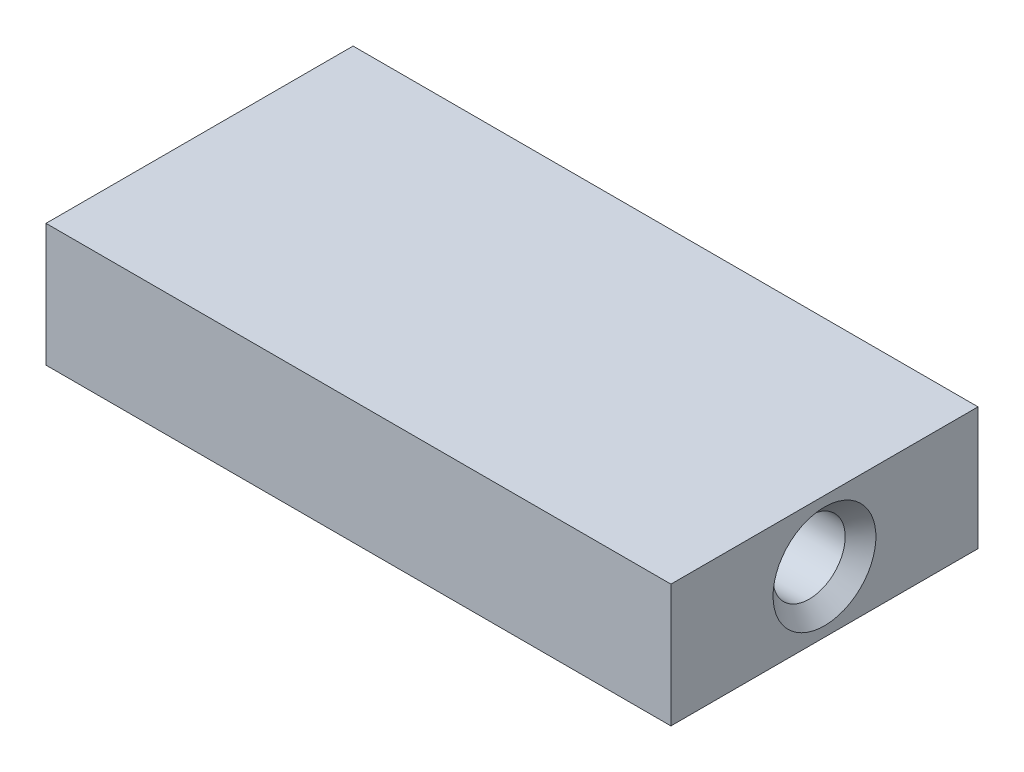
ISO-10303-21;
HEADER;
FILE_DESCRIPTION(('STEP AP214'),'2;1');
FILE_NAME('part.step','',(''),(''),'','','');
FILE_SCHEMA(('AUTOMOTIVE_DESIGN { 1 0 10303 214 1 1 1 1 }'));
ENDSEC;
DATA;
#1=APPLICATION_CONTEXT('core data for automotive mechanical design processes');
#2=APPLICATION_PROTOCOL_DEFINITION('international standard','automotive_design',2000,#1);
#3=PRODUCT_CONTEXT('',#1,'mechanical');
#4=PRODUCT('Part','Part','',(#3));
#5=PRODUCT_RELATED_PRODUCT_CATEGORY('part','',(#4));
#6=PRODUCT_DEFINITION_FORMATION('','',#4);
#7=PRODUCT_DEFINITION_CONTEXT('part definition',#1,'design');
#8=PRODUCT_DEFINITION('design','',#6,#7);
#9=PRODUCT_DEFINITION_SHAPE('','',#8);
#10=(LENGTH_UNIT() NAMED_UNIT(*) SI_UNIT(.MILLI.,.METRE.));
#11=(NAMED_UNIT(*) PLANE_ANGLE_UNIT() SI_UNIT($,.RADIAN.));
#12=(NAMED_UNIT(*) SI_UNIT($,.STERADIAN.) SOLID_ANGLE_UNIT());
#13=UNCERTAINTY_MEASURE_WITH_UNIT(LENGTH_MEASURE(1.E-05),#10,'distance_accuracy_value','');
#14=(GEOMETRIC_REPRESENTATION_CONTEXT(3) GLOBAL_UNCERTAINTY_ASSIGNED_CONTEXT((#13)) GLOBAL_UNIT_ASSIGNED_CONTEXT((#10,
#11,#12)) REPRESENTATION_CONTEXT('',''));
#15=CARTESIAN_POINT('',(0.,0.,0.));
#16=DIRECTION('',(0.,0.,1.));
#17=DIRECTION('',(1.,0.,0.));
#18=AXIS2_PLACEMENT_3D('',#15,#16,#17);
#19=CARTESIAN_POINT('',(20.35,8.,-10.));
#20=DIRECTION('',(-1.,0.,0.));
#21=DIRECTION('',(0.,0.,1.));
#22=AXIS2_PLACEMENT_3D('',#19,#20,#21);
#23=PLANE('',#22);
#24=CARTESIAN_POINT('',(20.35,4.,0.));
#25=DIRECTION('',(-1.,0.,0.));
#26=DIRECTION('',(0.,0.,1.));
#27=AXIS2_PLACEMENT_3D('',#24,#25,#26);
#28=CIRCLE('',#27,3.35);
#29=CARTESIAN_POINT('',(20.35,4.,3.35));
#30=VERTEX_POINT('',#29);
#31=EDGE_CURVE('E11',#30,#30,#28,.T.);
#32=ORIENTED_EDGE('',*,*,#31,.T.);
#33=EDGE_LOOP('',(#32));
#34=FACE_BOUND('',#33,.T.);
#35=DIRECTION('',(0.,0.,-1.));
#36=VECTOR('',#35,1.);
#37=CARTESIAN_POINT('',(20.35,0.,-10.));
#38=LINE('',#37,#36);
#39=CARTESIAN_POINT('',(20.35,0.,10.));
#40=VERTEX_POINT('',#39);
#41=CARTESIAN_POINT('',(20.35,0.,-10.));
#42=VERTEX_POINT('',#41);
#43=EDGE_CURVE('E114',#40,#42,#38,.T.);
#44=ORIENTED_EDGE('',*,*,#43,.T.);
#45=DIRECTION('',(0.,-1.,0.));
#46=VECTOR('',#45,1.);
#47=CARTESIAN_POINT('',(20.35,8.,-10.));
#48=LINE('',#47,#46);
#49=CARTESIAN_POINT('',(20.35,8.,-10.));
#50=VERTEX_POINT('',#49);
#51=EDGE_CURVE('E105',#50,#42,#48,.T.);
#52=ORIENTED_EDGE('',*,*,#51,.F.);
#53=DIRECTION('',(0.,0.,-1.));
#54=VECTOR('',#53,1.);
#55=CARTESIAN_POINT('',(20.35,8.,-10.));
#56=LINE('',#55,#54);
#57=CARTESIAN_POINT('',(20.35,8.,10.));
#58=VERTEX_POINT('',#57);
#59=EDGE_CURVE('E99',#58,#50,#56,.T.);
#60=ORIENTED_EDGE('',*,*,#59,.F.);
#61=DIRECTION('',(0.,-1.,0.));
#62=VECTOR('',#61,1.);
#63=CARTESIAN_POINT('',(20.35,8.,10.));
#64=LINE('',#63,#62);
#65=EDGE_CURVE('E110',#58,#40,#64,.T.);
#66=ORIENTED_EDGE('',*,*,#65,.T.);
#67=EDGE_LOOP('',(#44,#52,#60,#66));
#68=FACE_BOUND('',#67,.T.);
#69=ADVANCED_FACE('F45',(#34,#68),#23,.F.);
#70=CARTESIAN_POINT('',(-20.35,8.,-10.));
#71=DIRECTION('',(0.,0.,1.));
#72=DIRECTION('',(1.,0.,0.));
#73=AXIS2_PLACEMENT_3D('',#70,#71,#72);
#74=PLANE('',#73);
#75=DIRECTION('',(-1.,0.,0.));
#76=VECTOR('',#75,1.);
#77=CARTESIAN_POINT('',(-20.35,0.,-10.));
#78=LINE('',#77,#76);
#79=CARTESIAN_POINT('',(-20.35,0.,-10.));
#80=VERTEX_POINT('',#79);
#81=EDGE_CURVE('E104',#42,#80,#78,.T.);
#82=ORIENTED_EDGE('',*,*,#81,.T.);
#83=DIRECTION('',(0.,-1.,0.));
#84=VECTOR('',#83,1.);
#85=CARTESIAN_POINT('',(-20.35,8.,-10.));
#86=LINE('',#85,#84);
#87=CARTESIAN_POINT('',(-20.35,8.,-10.));
#88=VERTEX_POINT('',#87);
#89=EDGE_CURVE('E102',#88,#80,#86,.T.);
#90=ORIENTED_EDGE('',*,*,#89,.F.);
#91=DIRECTION('',(-1.,0.,0.));
#92=VECTOR('',#91,1.);
#93=CARTESIAN_POINT('',(-20.35,8.,-10.));
#94=LINE('',#93,#92);
#95=EDGE_CURVE('E94',#50,#88,#94,.T.);
#96=ORIENTED_EDGE('',*,*,#95,.F.);
#97=ORIENTED_EDGE('',*,*,#51,.T.);
#98=EDGE_LOOP('',(#82,#90,#96,#97));
#99=FACE_BOUND('',#98,.T.);
#100=ADVANCED_FACE('F103',(#99),#74,.F.);
#101=CARTESIAN_POINT('',(-20.35,8.,-10.));
#102=DIRECTION('',(1.,0.,0.));
#103=DIRECTION('',(0.,0.,-1.));
#104=AXIS2_PLACEMENT_3D('',#101,#102,#103);
#105=PLANE('',#104);
#106=CARTESIAN_POINT('',(-20.35,4.,0.));
#107=DIRECTION('',(1.,0.,0.));
#108=DIRECTION('',(0.,0.,-1.));
#109=AXIS2_PLACEMENT_3D('',#106,#107,#108);
#110=CIRCLE('',#109,3.34999999999999);
#111=CARTESIAN_POINT('',(-20.35,4.,-3.34999999999999));
#112=VERTEX_POINT('',#111);
#113=EDGE_CURVE('E127',#112,#112,#110,.T.);
#114=ORIENTED_EDGE('',*,*,#113,.T.);
#115=EDGE_LOOP('',(#114));
#116=FACE_BOUND('',#115,.T.);
#117=DIRECTION('',(0.,0.,1.));
#118=VECTOR('',#117,1.);
#119=CARTESIAN_POINT('',(-20.35,0.,-10.));
#120=LINE('',#119,#118);
#121=CARTESIAN_POINT('',(-20.35,0.,10.));
#122=VERTEX_POINT('',#121);
#123=EDGE_CURVE('E80',#80,#122,#120,.T.);
#124=ORIENTED_EDGE('',*,*,#123,.T.);
#125=DIRECTION('',(0.,-1.,0.));
#126=VECTOR('',#125,1.);
#127=CARTESIAN_POINT('',(-20.35,8.,10.));
#128=LINE('',#127,#126);
#129=CARTESIAN_POINT('',(-20.35,8.,10.));
#130=VERTEX_POINT('',#129);
#131=EDGE_CURVE('E106',#130,#122,#128,.T.);
#132=ORIENTED_EDGE('',*,*,#131,.F.);
#133=DIRECTION('',(0.,0.,1.));
#134=VECTOR('',#133,1.);
#135=CARTESIAN_POINT('',(-20.35,8.,-10.));
#136=LINE('',#135,#134);
#137=EDGE_CURVE('E97',#88,#130,#136,.T.);
#138=ORIENTED_EDGE('',*,*,#137,.F.);
#139=ORIENTED_EDGE('',*,*,#89,.T.);
#140=EDGE_LOOP('',(#124,#132,#138,#139));
#141=FACE_BOUND('',#140,.T.);
#142=ADVANCED_FACE('F108',(#116,#141),#105,.F.);
#143=CARTESIAN_POINT('',(-20.35,8.,10.));
#144=DIRECTION('',(0.,0.,-1.));
#145=DIRECTION('',(-1.,0.,0.));
#146=AXIS2_PLACEMENT_3D('',#143,#144,#145);
#147=PLANE('',#146);
#148=DIRECTION('',(1.,0.,0.));
#149=VECTOR('',#148,1.);
#150=CARTESIAN_POINT('',(-20.35,0.,10.));
#151=LINE('',#150,#149);
#152=EDGE_CURVE('E86',#122,#40,#151,.T.);
#153=ORIENTED_EDGE('',*,*,#152,.T.);
#154=ORIENTED_EDGE('',*,*,#65,.F.);
#155=DIRECTION('',(1.,0.,0.));
#156=VECTOR('',#155,1.);
#157=CARTESIAN_POINT('',(-20.35,8.,10.));
#158=LINE('',#157,#156);
#159=EDGE_CURVE('E63',#130,#58,#158,.T.);
#160=ORIENTED_EDGE('',*,*,#159,.F.);
#161=ORIENTED_EDGE('',*,*,#131,.T.);
#162=EDGE_LOOP('',(#153,#154,#160,#161));
#163=FACE_BOUND('',#162,.T.);
#164=ADVANCED_FACE('F161',(#163),#147,.F.);
#165=CARTESIAN_POINT('',(0.,8.,0.));
#166=DIRECTION('',(0.,1.,0.));
#167=DIRECTION('',(0.,0.,1.));
#168=AXIS2_PLACEMENT_3D('',#165,#166,#167);
#169=PLANE('',#168);
#170=ORIENTED_EDGE('',*,*,#59,.T.);
#171=ORIENTED_EDGE('',*,*,#95,.T.);
#172=ORIENTED_EDGE('',*,*,#137,.T.);
#173=ORIENTED_EDGE('',*,*,#159,.T.);
#174=EDGE_LOOP('',(#170,#171,#172,#173));
#175=FACE_BOUND('',#174,.T.);
#176=ADVANCED_FACE('F95',(#175),#169,.T.);
#177=CARTESIAN_POINT('',(0.,0.,0.));
#178=DIRECTION('',(0.,1.,0.));
#179=DIRECTION('',(0.,0.,1.));
#180=AXIS2_PLACEMENT_3D('',#177,#178,#179);
#181=PLANE('',#180);
#182=ORIENTED_EDGE('',*,*,#43,.F.);
#183=ORIENTED_EDGE('',*,*,#152,.F.);
#184=ORIENTED_EDGE('',*,*,#123,.F.);
#185=ORIENTED_EDGE('',*,*,#81,.F.);
#186=EDGE_LOOP('',(#182,#183,#184,#185));
#187=FACE_BOUND('',#186,.T.);
#188=ADVANCED_FACE('F165',(#187),#181,.F.);
#189=CARTESIAN_POINT('',(10.35,4.,0.));
#190=DIRECTION('',(1.,0.,0.));
#191=DIRECTION('',(0.,0.,-1.));
#192=AXIS2_PLACEMENT_3D('',#189,#190,#191);
#193=CYLINDRICAL_SURFACE('',#192,2.35);
#194=CARTESIAN_POINT('',(19.35,4.,0.));
#195=DIRECTION('',(-1.,0.,0.));
#196=DIRECTION('',(0.,0.,1.));
#197=AXIS2_PLACEMENT_3D('',#194,#195,#196);
#198=CIRCLE('',#197,2.35);
#199=CARTESIAN_POINT('',(19.35,4.,2.35));
#200=VERTEX_POINT('',#199);
#201=EDGE_CURVE('E55',#200,#200,#198,.F.);
#202=ORIENTED_EDGE('',*,*,#201,.T.);
#203=EDGE_LOOP('',(#202));
#204=FACE_BOUND('',#203,.T.);
#205=CARTESIAN_POINT('',(10.35,4.,0.));
#206=DIRECTION('',(1.,0.,0.));
#207=DIRECTION('',(0.,0.,-1.));
#208=AXIS2_PLACEMENT_3D('',#205,#206,#207);
#209=CIRCLE('',#208,2.35);
#210=CARTESIAN_POINT('',(10.35,4.,-2.35));
#211=VERTEX_POINT('',#210);
#212=EDGE_CURVE('E117',#211,#211,#209,.T.);
#213=ORIENTED_EDGE('',*,*,#212,.F.);
#214=EDGE_LOOP('',(#213));
#215=FACE_BOUND('',#214,.T.);
#216=ADVANCED_FACE('F132',(#204,#215),#193,.F.);
#217=CARTESIAN_POINT('',(10.35,4.,0.));
#218=DIRECTION('',(1.,0.,0.));
#219=DIRECTION('',(0.,0.,-1.));
#220=AXIS2_PLACEMENT_3D('',#217,#218,#219);
#221=PLANE('',#220);
#222=ORIENTED_EDGE('',*,*,#212,.T.);
#223=EDGE_LOOP('',(#222));
#224=FACE_BOUND('',#223,.T.);
#225=ADVANCED_FACE('F172',(#224),#221,.T.);
#226=CARTESIAN_POINT('',(-10.35,4.,0.));
#227=DIRECTION('',(-1.,0.,0.));
#228=DIRECTION('',(0.,0.,1.));
#229=AXIS2_PLACEMENT_3D('',#226,#227,#228);
#230=CYLINDRICAL_SURFACE('',#229,2.35);
#231=CARTESIAN_POINT('',(-19.35,4.,0.));
#232=DIRECTION('',(1.,0.,0.));
#233=DIRECTION('',(0.,0.,-1.));
#234=AXIS2_PLACEMENT_3D('',#231,#232,#233);
#235=CIRCLE('',#234,2.35);
#236=CARTESIAN_POINT('',(-19.35,4.,-2.35));
#237=VERTEX_POINT('',#236);
#238=EDGE_CURVE('E124',#237,#237,#235,.F.);
#239=ORIENTED_EDGE('',*,*,#238,.T.);
#240=EDGE_LOOP('',(#239));
#241=FACE_BOUND('',#240,.T.);
#242=CARTESIAN_POINT('',(-10.35,4.,0.));
#243=DIRECTION('',(-1.,0.,0.));
#244=DIRECTION('',(0.,0.,1.));
#245=AXIS2_PLACEMENT_3D('',#242,#243,#244);
#246=CIRCLE('',#245,2.35);
#247=CARTESIAN_POINT('',(-10.35,4.,2.35));
#248=VERTEX_POINT('',#247);
#249=EDGE_CURVE('E186',#248,#248,#246,.T.);
#250=ORIENTED_EDGE('',*,*,#249,.F.);
#251=EDGE_LOOP('',(#250));
#252=FACE_BOUND('',#251,.T.);
#253=ADVANCED_FACE('F175',(#241,#252),#230,.F.);
#254=CARTESIAN_POINT('',(-10.35,4.,0.));
#255=DIRECTION('',(-1.,0.,0.));
#256=DIRECTION('',(0.,0.,1.));
#257=AXIS2_PLACEMENT_3D('',#254,#255,#256);
#258=PLANE('',#257);
#259=ORIENTED_EDGE('',*,*,#249,.T.);
#260=EDGE_LOOP('',(#259));
#261=FACE_BOUND('',#260,.T.);
#262=ADVANCED_FACE('F141',(#261),#258,.T.);
#263=CARTESIAN_POINT('',(-19.35,4.,0.));
#264=DIRECTION('',(-1.,0.,0.));
#265=DIRECTION('',(0.,0.,1.));
#266=AXIS2_PLACEMENT_3D('',#263,#264,#265);
#267=CONICAL_SURFACE('',#266,2.35,0.78539816339745);
#268=ORIENTED_EDGE('',*,*,#113,.F.);
#269=EDGE_LOOP('',(#268));
#270=FACE_BOUND('',#269,.T.);
#271=ORIENTED_EDGE('',*,*,#238,.F.);
#272=EDGE_LOOP('',(#271));
#273=FACE_BOUND('',#272,.T.);
#274=ADVANCED_FACE('F136',(#270,#273),#267,.F.);
#275=CARTESIAN_POINT('',(19.35,4.,0.));
#276=DIRECTION('',(1.,0.,0.));
#277=DIRECTION('',(0.,0.,-1.));
#278=AXIS2_PLACEMENT_3D('',#275,#276,#277);
#279=CONICAL_SURFACE('',#278,2.35,0.78539816339745);
#280=ORIENTED_EDGE('',*,*,#31,.F.);
#281=EDGE_LOOP('',(#280));
#282=FACE_BOUND('',#281,.T.);
#283=ORIENTED_EDGE('',*,*,#201,.F.);
#284=EDGE_LOOP('',(#283));
#285=FACE_BOUND('',#284,.T.);
#286=ADVANCED_FACE('F48',(#282,#285),#279,.F.);
#287=CLOSED_SHELL('',(#69,#100,#142,#164,#176,#188,#216,#225,#253,#262,#274,#286));
#288=MANIFOLD_SOLID_BREP('B2',#287);
#289=ADVANCED_BREP_SHAPE_REPRESENTATION('',(#18,#288),#14);
#290=SHAPE_DEFINITION_REPRESENTATION(#9,#289);
ENDSEC;
END-ISO-10303-21;
